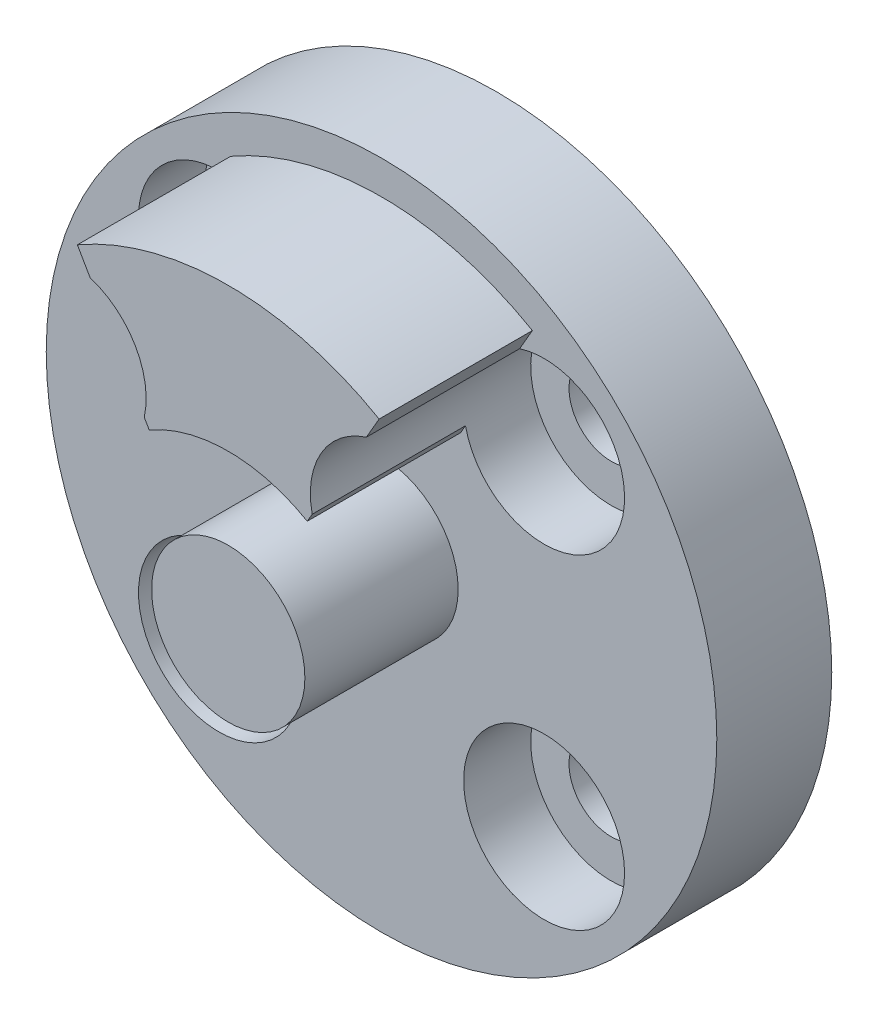
ISO-10303-21;
HEADER;
FILE_DESCRIPTION(('STEP AP214'),'2;1');
FILE_NAME('part.step','',(''),(''),'','','');
FILE_SCHEMA(('AUTOMOTIVE_DESIGN { 1 0 10303 214 1 1 1 1 }'));
ENDSEC;
DATA;
#1=APPLICATION_CONTEXT('core data for automotive mechanical design processes');
#2=APPLICATION_PROTOCOL_DEFINITION('international standard','automotive_design',2000,#1);
#3=PRODUCT_CONTEXT('',#1,'mechanical');
#4=PRODUCT('Part','Part','',(#3));
#5=PRODUCT_RELATED_PRODUCT_CATEGORY('part','',(#4));
#6=PRODUCT_DEFINITION_FORMATION('','',#4);
#7=PRODUCT_DEFINITION_CONTEXT('part definition',#1,'design');
#8=PRODUCT_DEFINITION('design','',#6,#7);
#9=PRODUCT_DEFINITION_SHAPE('','',#8);
#10=(LENGTH_UNIT() NAMED_UNIT(*) SI_UNIT(.MILLI.,.METRE.));
#11=(NAMED_UNIT(*) PLANE_ANGLE_UNIT() SI_UNIT($,.RADIAN.));
#12=(NAMED_UNIT(*) SI_UNIT($,.STERADIAN.) SOLID_ANGLE_UNIT());
#13=UNCERTAINTY_MEASURE_WITH_UNIT(LENGTH_MEASURE(1.E-05),#10,'distance_accuracy_value','');
#14=(GEOMETRIC_REPRESENTATION_CONTEXT(3) GLOBAL_UNCERTAINTY_ASSIGNED_CONTEXT((#13)) GLOBAL_UNIT_ASSIGNED_CONTEXT((#10,
#11,#12)) REPRESENTATION_CONTEXT('',''));
#15=CARTESIAN_POINT('',(0.,0.,0.));
#16=DIRECTION('',(0.,0.,1.));
#17=DIRECTION('',(1.,0.,0.));
#18=AXIS2_PLACEMENT_3D('',#15,#16,#17);
#19=CARTESIAN_POINT('',(-4.12499999999996,7.14470958122165,11.));
#20=DIRECTION('',(0.866025403784441,0.499999999999996,0.));
#21=DIRECTION('',(-0.499999999999996,0.866025403784441,0.));
#22=AXIS2_PLACEMENT_3D('',#19,#20,#21);
#23=PLANE('',#22);
#24=DIRECTION('',(0.,0.,-1.));
#25=VECTOR('',#24,1.);
#26=CARTESIAN_POINT('',(-4.38188693867168,7.58965081080189,22.879393923934));
#27=LINE('',#26,#25);
#28=CARTESIAN_POINT('',(-4.38188693867168,7.58965081080189,3.));
#29=VERTEX_POINT('',#28);
#30=CARTESIAN_POINT('',(-4.38188693867168,7.58965081080189,11.));
#31=VERTEX_POINT('',#30);
#32=EDGE_CURVE('E62',#29,#31,#27,.F.);
#33=ORIENTED_EDGE('',*,*,#32,.F.);
#34=DIRECTION('',(0.499999999999996,-0.866025403784441,0.));
#35=VECTOR('',#34,1.);
#36=CARTESIAN_POINT('',(-4.12499999999996,7.14470958122165,3.));
#37=LINE('',#36,#35);
#38=CARTESIAN_POINT('',(-4.12499999999996,7.14470958122165,3.));
#39=VERTEX_POINT('',#38);
#40=EDGE_CURVE('E141',#29,#39,#37,.T.);
#41=ORIENTED_EDGE('',*,*,#40,.T.);
#42=DIRECTION('',(0.,0.,-1.));
#43=VECTOR('',#42,1.);
#44=CARTESIAN_POINT('',(-4.12499999999996,7.14470958122165,11.));
#45=LINE('',#44,#43);
#46=CARTESIAN_POINT('',(-4.12499999999996,7.14470958122165,11.));
#47=VERTEX_POINT('',#46);
#48=EDGE_CURVE('E155',#47,#39,#45,.T.);
#49=ORIENTED_EDGE('',*,*,#48,.F.);
#50=DIRECTION('',(0.499999999999996,-0.866025403784441,0.));
#51=VECTOR('',#50,1.);
#52=CARTESIAN_POINT('',(-4.12499999999996,7.14470958122165,11.));
#53=LINE('',#52,#51);
#54=EDGE_CURVE('E127',#31,#47,#53,.T.);
#55=ORIENTED_EDGE('',*,*,#54,.F.);
#56=EDGE_LOOP('',(#33,#41,#49,#55));
#57=FACE_BOUND('',#56,.T.);
#58=ADVANCED_FACE('F38',(#57),#23,.F.);
#59=DIRECTION('',(0.,0.,-1.));
#60=VECTOR('',#59,1.);
#61=CARTESIAN_POINT('',(-7.20922297679721,12.4867404789059,22.879393923934));
#62=LINE('',#61,#60);
#63=CARTESIAN_POINT('',(-7.20922297679721,12.4867404789059,11.));
#64=VERTEX_POINT('',#63);
#65=CARTESIAN_POINT('',(-7.20922297679721,12.4867404789059,3.));
#66=VERTEX_POINT('',#65);
#67=EDGE_CURVE('E104',#64,#66,#62,.T.);
#68=ORIENTED_EDGE('',*,*,#67,.F.);
#69=CARTESIAN_POINT('',(-7.87499999999993,13.639900109605,11.));
#70=VERTEX_POINT('',#69);
#71=EDGE_CURVE('E115',#70,#64,#53,.T.);
#72=ORIENTED_EDGE('',*,*,#71,.F.);
#73=DIRECTION('',(0.,0.,-1.));
#74=VECTOR('',#73,1.);
#75=CARTESIAN_POINT('',(-7.87499999999993,13.639900109605,11.));
#76=LINE('',#75,#74);
#77=CARTESIAN_POINT('',(-7.87499999999993,13.639900109605,3.));
#78=VERTEX_POINT('',#77);
#79=EDGE_CURVE('E158',#70,#78,#76,.T.);
#80=ORIENTED_EDGE('',*,*,#79,.T.);
#81=EDGE_CURVE('E118',#78,#66,#37,.T.);
#82=ORIENTED_EDGE('',*,*,#81,.T.);
#83=EDGE_LOOP('',(#68,#72,#80,#82));
#84=FACE_BOUND('',#83,.T.);
#85=ADVANCED_FACE('F114',(#84),#23,.F.);
#86=CARTESIAN_POINT('',(7.87499999999993,13.639900109605,11.));
#87=DIRECTION('',(-0.866025403784441,0.499999999999995,0.));
#88=DIRECTION('',(-0.499999999999995,-0.866025403784441,0.));
#89=AXIS2_PLACEMENT_3D('',#86,#87,#88);
#90=PLANE('',#89);
#91=DIRECTION('',(0.,0.,-1.));
#92=VECTOR('',#91,1.);
#93=CARTESIAN_POINT('',(7.20922297679622,12.4867404789042,22.879393923934));
#94=LINE('',#93,#92);
#95=CARTESIAN_POINT('',(7.20922297679623,12.4867404789042,3.));
#96=VERTEX_POINT('',#95);
#97=CARTESIAN_POINT('',(7.20922297679623,12.4867404789042,11.));
#98=VERTEX_POINT('',#97);
#99=EDGE_CURVE('E54',#96,#98,#94,.F.);
#100=ORIENTED_EDGE('',*,*,#99,.F.);
#101=DIRECTION('',(0.499999999999995,0.866025403784441,0.));
#102=VECTOR('',#101,1.);
#103=CARTESIAN_POINT('',(7.87499999999993,13.639900109605,3.));
#104=LINE('',#103,#102);
#105=CARTESIAN_POINT('',(7.87499999999993,13.639900109605,3.));
#106=VERTEX_POINT('',#105);
#107=EDGE_CURVE('E147',#96,#106,#104,.T.);
#108=ORIENTED_EDGE('',*,*,#107,.T.);
#109=DIRECTION('',(0.,0.,-1.));
#110=VECTOR('',#109,1.);
#111=CARTESIAN_POINT('',(7.87499999999993,13.639900109605,11.));
#112=LINE('',#111,#110);
#113=CARTESIAN_POINT('',(7.87499999999993,13.639900109605,11.));
#114=VERTEX_POINT('',#113);
#115=EDGE_CURVE('E137',#114,#106,#112,.T.);
#116=ORIENTED_EDGE('',*,*,#115,.F.);
#117=DIRECTION('',(0.499999999999995,0.866025403784441,0.));
#118=VECTOR('',#117,1.);
#119=CARTESIAN_POINT('',(7.87499999999993,13.639900109605,11.));
#120=LINE('',#119,#118);
#121=EDGE_CURVE('E129',#98,#114,#120,.T.);
#122=ORIENTED_EDGE('',*,*,#121,.F.);
#123=EDGE_LOOP('',(#100,#108,#116,#122));
#124=FACE_BOUND('',#123,.T.);
#125=ADVANCED_FACE('F219',(#124),#90,.F.);
#126=DIRECTION('',(0.,0.,-1.));
#127=VECTOR('',#126,1.);
#128=CARTESIAN_POINT('',(4.38188693867227,7.58965081080293,22.879393923934));
#129=LINE('',#128,#127);
#130=CARTESIAN_POINT('',(4.38188693867227,7.58965081080293,11.));
#131=VERTEX_POINT('',#130);
#132=CARTESIAN_POINT('',(4.38188693867227,7.58965081080293,3.));
#133=VERTEX_POINT('',#132);
#134=EDGE_CURVE('E184',#131,#133,#129,.T.);
#135=ORIENTED_EDGE('',*,*,#134,.F.);
#136=CARTESIAN_POINT('',(4.12499999999996,7.14470958122164,11.));
#137=VERTEX_POINT('',#136);
#138=EDGE_CURVE('E134',#137,#131,#120,.T.);
#139=ORIENTED_EDGE('',*,*,#138,.F.);
#140=DIRECTION('',(0.,0.,-1.));
#141=VECTOR('',#140,1.);
#142=CARTESIAN_POINT('',(4.12499999999996,7.14470958122164,11.));
#143=LINE('',#142,#141);
#144=CARTESIAN_POINT('',(4.12499999999996,7.14470958122164,3.));
#145=VERTEX_POINT('',#144);
#146=EDGE_CURVE('E153',#137,#145,#143,.T.);
#147=ORIENTED_EDGE('',*,*,#146,.T.);
#148=EDGE_CURVE('E148',#145,#133,#104,.T.);
#149=ORIENTED_EDGE('',*,*,#148,.T.);
#150=EDGE_LOOP('',(#135,#139,#147,#149));
#151=FACE_BOUND('',#150,.T.);
#152=ADVANCED_FACE('F232',(#151),#90,.F.);
#153=CARTESIAN_POINT('',(8.48528137423862,8.48528137423853,9.22253967444338));
#154=DIRECTION('',(0.,0.,-1.));
#155=DIRECTION('',(-1.,0.,0.));
#156=AXIS2_PLACEMENT_3D('',#153,#154,#155);
#157=CYLINDRICAL_SURFACE('',#156,2.2);
#158=CARTESIAN_POINT('',(8.48528137423862,8.48528137423853,-3.));
#159=DIRECTION('',(0.,0.,-1.));
#160=DIRECTION('',(-1.,0.,0.));
#161=AXIS2_PLACEMENT_3D('',#158,#159,#160);
#162=CIRCLE('',#161,2.2);
#163=CARTESIAN_POINT('',(6.28528137423862,8.48528137423853,-3.));
#164=VERTEX_POINT('',#163);
#165=EDGE_CURVE('E191',#164,#164,#162,.T.);
#166=CARTESIAN_POINT('',(8.48528137423862,8.48528137423853,-0.5));
#167=DIRECTION('',(0.,0.,1.));
#168=DIRECTION('',(1.,0.,0.));
#169=AXIS2_PLACEMENT_3D('',#166,#167,#168);
#170=CIRCLE('',#169,2.2);
#171=CARTESIAN_POINT('',(6.28528137423862,8.48528137423853,-0.500000000000002));
#172=VERTEX_POINT('',#171);
#173=EDGE_CURVE('E120',#172,#172,#170,.F.);
#174=CARTESIAN_POINT('',(6.28528137423862,8.48528137423853,-3.));
#175=CARTESIAN_POINT('',(6.28528137423862,8.48528137423853,-2.97395833333333));
#176=CARTESIAN_POINT('',(6.28528137423862,8.48528137423853,-2.94791666666667));
#177=CARTESIAN_POINT('',(6.28528137423862,8.48528137423853,-2.89583333333333));
#178=CARTESIAN_POINT('',(6.28528137423862,8.48528137423853,-2.86979166666667));
#179=CARTESIAN_POINT('',(6.28528137423862,8.48528137423853,-2.81770833333333));
#180=CARTESIAN_POINT('',(6.28528137423862,8.48528137423853,-2.79166666666667));
#181=CARTESIAN_POINT('',(6.28528137423862,8.48528137423853,-2.73958333333333));
#182=CARTESIAN_POINT('',(6.28528137423862,8.48528137423853,-2.71354166666667));
#183=CARTESIAN_POINT('',(6.28528137423862,8.48528137423853,-2.66145833333333));
#184=CARTESIAN_POINT('',(6.28528137423862,8.48528137423853,-2.63541666666667));
#185=CARTESIAN_POINT('',(6.28528137423862,8.48528137423853,-2.58333333333333));
#186=CARTESIAN_POINT('',(6.28528137423862,8.48528137423853,-2.55729166666667));
#187=CARTESIAN_POINT('',(6.28528137423862,8.48528137423853,-2.50520833333333));
#188=CARTESIAN_POINT('',(6.28528137423862,8.48528137423853,-2.47916666666667));
#189=CARTESIAN_POINT('',(6.28528137423862,8.48528137423853,-2.42708333333333));
#190=CARTESIAN_POINT('',(6.28528137423862,8.48528137423853,-2.40104166666667));
#191=CARTESIAN_POINT('',(6.28528137423862,8.48528137423853,-2.34895833333333));
#192=CARTESIAN_POINT('',(6.28528137423862,8.48528137423853,-2.32291666666667));
#193=CARTESIAN_POINT('',(6.28528137423862,8.48528137423853,-2.27083333333334));
#194=CARTESIAN_POINT('',(6.28528137423862,8.48528137423853,-2.24479166666667));
#195=CARTESIAN_POINT('',(6.28528137423862,8.48528137423853,-2.19270833333334));
#196=CARTESIAN_POINT('',(6.28528137423862,8.48528137423853,-2.16666666666667));
#197=CARTESIAN_POINT('',(6.28528137423862,8.48528137423853,-2.11458333333334));
#198=CARTESIAN_POINT('',(6.28528137423862,8.48528137423853,-2.08854166666667));
#199=CARTESIAN_POINT('',(6.28528137423862,8.48528137423853,-2.03645833333333));
#200=CARTESIAN_POINT('',(6.28528137423862,8.48528137423853,-2.01041666666667));
#201=CARTESIAN_POINT('',(6.28528137423862,8.48528137423853,-1.95833333333334));
#202=CARTESIAN_POINT('',(6.28528137423862,8.48528137423853,-1.93229166666667));
#203=CARTESIAN_POINT('',(6.28528137423862,8.48528137423853,-1.88020833333334));
#204=CARTESIAN_POINT('',(6.28528137423862,8.48528137423853,-1.85416666666667));
#205=CARTESIAN_POINT('',(6.28528137423862,8.48528137423853,-1.80208333333334));
#206=CARTESIAN_POINT('',(6.28528137423862,8.48528137423853,-1.77604166666667));
#207=CARTESIAN_POINT('',(6.28528137423862,8.48528137423853,-1.72395833333334));
#208=CARTESIAN_POINT('',(6.28528137423862,8.48528137423853,-1.69791666666667));
#209=CARTESIAN_POINT('',(6.28528137423862,8.48528137423853,-1.64583333333333));
#210=CARTESIAN_POINT('',(6.28528137423862,8.48528137423853,-1.61979166666667));
#211=CARTESIAN_POINT('',(6.28528137423862,8.48528137423853,-1.56770833333333));
#212=CARTESIAN_POINT('',(6.28528137423862,8.48528137423853,-1.54166666666667));
#213=CARTESIAN_POINT('',(6.28528137423862,8.48528137423853,-1.48958333333333));
#214=CARTESIAN_POINT('',(6.28528137423862,8.48528137423853,-1.46354166666667));
#215=CARTESIAN_POINT('',(6.28528137423862,8.48528137423853,-1.41145833333333));
#216=CARTESIAN_POINT('',(6.28528137423862,8.48528137423853,-1.38541666666667));
#217=CARTESIAN_POINT('',(6.28528137423862,8.48528137423853,-1.33333333333333));
#218=CARTESIAN_POINT('',(6.28528137423862,8.48528137423853,-1.30729166666667));
#219=CARTESIAN_POINT('',(6.28528137423862,8.48528137423853,-1.25520833333333));
#220=CARTESIAN_POINT('',(6.28528137423862,8.48528137423853,-1.22916666666667));
#221=CARTESIAN_POINT('',(6.28528137423862,8.48528137423853,-1.17708333333333));
#222=CARTESIAN_POINT('',(6.28528137423862,8.48528137423853,-1.15104166666667));
#223=CARTESIAN_POINT('',(6.28528137423862,8.48528137423853,-1.09895833333334));
#224=CARTESIAN_POINT('',(6.28528137423862,8.48528137423853,-1.07291666666667));
#225=CARTESIAN_POINT('',(6.28528137423862,8.48528137423853,-1.02083333333333));
#226=CARTESIAN_POINT('',(6.28528137423862,8.48528137423853,-0.994791666666669));
#227=CARTESIAN_POINT('',(6.28528137423862,8.48528137423853,-0.942708333333336));
#228=CARTESIAN_POINT('',(6.28528137423862,8.48528137423853,-0.916666666666669));
#229=CARTESIAN_POINT('',(6.28528137423862,8.48528137423853,-0.864583333333336));
#230=CARTESIAN_POINT('',(6.28528137423862,8.48528137423853,-0.838541666666669));
#231=CARTESIAN_POINT('',(6.28528137423862,8.48528137423853,-0.786458333333336));
#232=CARTESIAN_POINT('',(6.28528137423862,8.48528137423853,-0.760416666666669));
#233=CARTESIAN_POINT('',(6.28528137423862,8.48528137423853,-0.708333333333336));
#234=CARTESIAN_POINT('',(6.28528137423862,8.48528137423853,-0.682291666666669));
#235=CARTESIAN_POINT('',(6.28528137423862,8.48528137423853,-0.630208333333336));
#236=CARTESIAN_POINT('',(6.28528137423862,8.48528137423853,-0.604166666666669));
#237=CARTESIAN_POINT('',(6.28528137423862,8.48528137423853,-0.552083333333335));
#238=CARTESIAN_POINT('',(6.28528137423862,8.48528137423853,-0.526041666666669));
#239=CARTESIAN_POINT('',(6.28528137423862,8.48528137423853,-0.500000000000002));
#240=B_SPLINE_CURVE_WITH_KNOTS('',3,(#174,#175,#176,#177,#178,#179,#180,#181,#182,#183,#184,
#185,#186,#187,#188,#189,#190,#191,#192,#193,#194,#195,#196,#197,#198,#199,#200,#201,#202,#203,
#204,#205,#206,#207,#208,#209,#210,#211,#212,#213,#214,#215,#216,#217,#218,#219,#220,#221,#222,
#223,#224,#225,#226,#227,#228,#229,#230,#231,#232,#233,#234,#235,#236,#237,#238,#239),
.UNSPECIFIED.,.F.,.F.,(4,2,2,2,2,2,2,2,2,2,2,2,2,2,2,2,2,2,2,2,2,2,2,2,2,2,2,2,2,2,2,2,4),(0.,
0.0781250000000001,0.15625,0.234375,0.3125,0.390625,0.46875,0.546875,0.625000000000001,
0.703124999999999,0.781249999999999,0.859374999999999,0.937499999999999,1.015625,1.09375,
1.171875,1.25,1.328125,1.40625,1.484375,1.5625,1.640625,1.71875,1.796875,1.875,1.953125,2.03125,
2.109375,2.1875,2.265625,2.34375,2.421875,2.5),.UNSPECIFIED.);
#241=EDGE_CURVE('BSEAM266',#164,#172,#240,.T.);
#242=ORIENTED_EDGE('',*,*,#165,.T.);
#243=ORIENTED_EDGE('',*,*,#173,.F.);
#244=ORIENTED_EDGE('',*,*,#241,.T.);
#245=ORIENTED_EDGE('',*,*,#241,.F.);
#246=EDGE_LOOP('',(#242,#244,#243,#245));
#247=FACE_BOUND('',#246,.T.);
#248=ADVANCED_FACE('F266',(#247),#157,.F.);
#249=CARTESIAN_POINT('',(-8.48528137423857,8.48528137423905,9.22253967444338));
#250=DIRECTION('',(0.,0.,-1.));
#251=DIRECTION('',(-1.,0.,0.));
#252=AXIS2_PLACEMENT_3D('',#249,#250,#251);
#253=CYLINDRICAL_SURFACE('',#252,2.20000000000044);
#254=CARTESIAN_POINT('',(-8.48528137423857,8.48528137423905,-3.));
#255=DIRECTION('',(0.,0.,-1.));
#256=DIRECTION('',(-1.,0.,0.));
#257=AXIS2_PLACEMENT_3D('',#254,#255,#256);
#258=CIRCLE('',#257,2.20000000000044);
#259=CARTESIAN_POINT('',(-10.685281374239,8.48528137423905,-3.));
#260=VERTEX_POINT('',#259);
#261=EDGE_CURVE('E188',#260,#260,#258,.T.);
#262=CARTESIAN_POINT('',(-8.48528137423857,8.48528137423905,-0.5));
#263=DIRECTION('',(0.,0.,1.));
#264=DIRECTION('',(1.,0.,0.));
#265=AXIS2_PLACEMENT_3D('',#262,#263,#264);
#266=CIRCLE('',#265,2.20000000000044);
#267=CARTESIAN_POINT('',(-10.685281374239,8.48528137423905,-0.500000000000002));
#268=VERTEX_POINT('',#267);
#269=EDGE_CURVE('E171',#268,#268,#266,.F.);
#270=CARTESIAN_POINT('',(-10.685281374239,8.48528137423905,-3.));
#271=CARTESIAN_POINT('',(-10.685281374239,8.48528137423905,-2.97395833333333));
#272=CARTESIAN_POINT('',(-10.685281374239,8.48528137423905,-2.94791666666667));
#273=CARTESIAN_POINT('',(-10.685281374239,8.48528137423905,-2.89583333333333));
#274=CARTESIAN_POINT('',(-10.685281374239,8.48528137423905,-2.86979166666667));
#275=CARTESIAN_POINT('',(-10.685281374239,8.48528137423905,-2.81770833333333));
#276=CARTESIAN_POINT('',(-10.685281374239,8.48528137423905,-2.79166666666667));
#277=CARTESIAN_POINT('',(-10.685281374239,8.48528137423905,-2.73958333333333));
#278=CARTESIAN_POINT('',(-10.685281374239,8.48528137423905,-2.71354166666667));
#279=CARTESIAN_POINT('',(-10.685281374239,8.48528137423905,-2.66145833333333));
#280=CARTESIAN_POINT('',(-10.685281374239,8.48528137423905,-2.63541666666667));
#281=CARTESIAN_POINT('',(-10.685281374239,8.48528137423905,-2.58333333333333));
#282=CARTESIAN_POINT('',(-10.685281374239,8.48528137423905,-2.55729166666667));
#283=CARTESIAN_POINT('',(-10.685281374239,8.48528137423905,-2.50520833333333));
#284=CARTESIAN_POINT('',(-10.685281374239,8.48528137423905,-2.47916666666667));
#285=CARTESIAN_POINT('',(-10.685281374239,8.48528137423905,-2.42708333333333));
#286=CARTESIAN_POINT('',(-10.685281374239,8.48528137423905,-2.40104166666667));
#287=CARTESIAN_POINT('',(-10.685281374239,8.48528137423905,-2.34895833333333));
#288=CARTESIAN_POINT('',(-10.685281374239,8.48528137423905,-2.32291666666667));
#289=CARTESIAN_POINT('',(-10.685281374239,8.48528137423905,-2.27083333333334));
#290=CARTESIAN_POINT('',(-10.685281374239,8.48528137423905,-2.24479166666667));
#291=CARTESIAN_POINT('',(-10.685281374239,8.48528137423905,-2.19270833333334));
#292=CARTESIAN_POINT('',(-10.685281374239,8.48528137423905,-2.16666666666667));
#293=CARTESIAN_POINT('',(-10.685281374239,8.48528137423905,-2.11458333333334));
#294=CARTESIAN_POINT('',(-10.685281374239,8.48528137423905,-2.08854166666667));
#295=CARTESIAN_POINT('',(-10.685281374239,8.48528137423905,-2.03645833333333));
#296=CARTESIAN_POINT('',(-10.685281374239,8.48528137423905,-2.01041666666667));
#297=CARTESIAN_POINT('',(-10.685281374239,8.48528137423905,-1.95833333333334));
#298=CARTESIAN_POINT('',(-10.685281374239,8.48528137423905,-1.93229166666667));
#299=CARTESIAN_POINT('',(-10.685281374239,8.48528137423905,-1.88020833333334));
#300=CARTESIAN_POINT('',(-10.685281374239,8.48528137423905,-1.85416666666667));
#301=CARTESIAN_POINT('',(-10.685281374239,8.48528137423905,-1.80208333333334));
#302=CARTESIAN_POINT('',(-10.685281374239,8.48528137423905,-1.77604166666667));
#303=CARTESIAN_POINT('',(-10.685281374239,8.48528137423905,-1.72395833333334));
#304=CARTESIAN_POINT('',(-10.685281374239,8.48528137423905,-1.69791666666667));
#305=CARTESIAN_POINT('',(-10.685281374239,8.48528137423905,-1.64583333333333));
#306=CARTESIAN_POINT('',(-10.685281374239,8.48528137423905,-1.61979166666667));
#307=CARTESIAN_POINT('',(-10.685281374239,8.48528137423905,-1.56770833333333));
#308=CARTESIAN_POINT('',(-10.685281374239,8.48528137423905,-1.54166666666667));
#309=CARTESIAN_POINT('',(-10.685281374239,8.48528137423905,-1.48958333333333));
#310=CARTESIAN_POINT('',(-10.685281374239,8.48528137423905,-1.46354166666667));
#311=CARTESIAN_POINT('',(-10.685281374239,8.48528137423905,-1.41145833333333));
#312=CARTESIAN_POINT('',(-10.685281374239,8.48528137423905,-1.38541666666667));
#313=CARTESIAN_POINT('',(-10.685281374239,8.48528137423905,-1.33333333333333));
#314=CARTESIAN_POINT('',(-10.685281374239,8.48528137423905,-1.30729166666667));
#315=CARTESIAN_POINT('',(-10.685281374239,8.48528137423905,-1.25520833333333));
#316=CARTESIAN_POINT('',(-10.685281374239,8.48528137423905,-1.22916666666667));
#317=CARTESIAN_POINT('',(-10.685281374239,8.48528137423905,-1.17708333333333));
#318=CARTESIAN_POINT('',(-10.685281374239,8.48528137423905,-1.15104166666667));
#319=CARTESIAN_POINT('',(-10.685281374239,8.48528137423905,-1.09895833333334));
#320=CARTESIAN_POINT('',(-10.685281374239,8.48528137423905,-1.07291666666667));
#321=CARTESIAN_POINT('',(-10.685281374239,8.48528137423905,-1.02083333333333));
#322=CARTESIAN_POINT('',(-10.685281374239,8.48528137423905,-0.994791666666669));
#323=CARTESIAN_POINT('',(-10.685281374239,8.48528137423905,-0.942708333333336));
#324=CARTESIAN_POINT('',(-10.685281374239,8.48528137423905,-0.916666666666669));
#325=CARTESIAN_POINT('',(-10.685281374239,8.48528137423905,-0.864583333333336));
#326=CARTESIAN_POINT('',(-10.685281374239,8.48528137423905,-0.838541666666669));
#327=CARTESIAN_POINT('',(-10.685281374239,8.48528137423905,-0.786458333333336));
#328=CARTESIAN_POINT('',(-10.685281374239,8.48528137423905,-0.760416666666669));
#329=CARTESIAN_POINT('',(-10.685281374239,8.48528137423905,-0.708333333333336));
#330=CARTESIAN_POINT('',(-10.685281374239,8.48528137423905,-0.682291666666669));
#331=CARTESIAN_POINT('',(-10.685281374239,8.48528137423905,-0.630208333333336));
#332=CARTESIAN_POINT('',(-10.685281374239,8.48528137423905,-0.604166666666669));
#333=CARTESIAN_POINT('',(-10.685281374239,8.48528137423905,-0.552083333333335));
#334=CARTESIAN_POINT('',(-10.685281374239,8.48528137423905,-0.526041666666669));
#335=CARTESIAN_POINT('',(-10.685281374239,8.48528137423905,-0.500000000000002));
#336=B_SPLINE_CURVE_WITH_KNOTS('',3,(#270,#271,#272,#273,#274,#275,#276,#277,#278,#279,#280,
#281,#282,#283,#284,#285,#286,#287,#288,#289,#290,#291,#292,#293,#294,#295,#296,#297,#298,#299,
#300,#301,#302,#303,#304,#305,#306,#307,#308,#309,#310,#311,#312,#313,#314,#315,#316,#317,#318,
#319,#320,#321,#322,#323,#324,#325,#326,#327,#328,#329,#330,#331,#332,#333,#334,#335),
.UNSPECIFIED.,.F.,.F.,(4,2,2,2,2,2,2,2,2,2,2,2,2,2,2,2,2,2,2,2,2,2,2,2,2,2,2,2,2,2,2,2,4),(0.,
0.0781250000000001,0.15625,0.234375,0.3125,0.390625,0.46875,0.546875,0.625000000000001,
0.703124999999999,0.781249999999999,0.859374999999999,0.937499999999999,1.015625,1.09375,
1.171875,1.25,1.328125,1.40625,1.484375,1.5625,1.640625,1.71875,1.796875,1.875,1.953125,2.03125,
2.109375,2.1875,2.265625,2.34375,2.421875,2.5),.UNSPECIFIED.);
#337=EDGE_CURVE('BSEAM269',#260,#268,#336,.T.);
#338=ORIENTED_EDGE('',*,*,#261,.T.);
#339=ORIENTED_EDGE('',*,*,#269,.F.);
#340=ORIENTED_EDGE('',*,*,#337,.T.);
#341=ORIENTED_EDGE('',*,*,#337,.F.);
#342=EDGE_LOOP('',(#338,#340,#339,#341));
#343=FACE_BOUND('',#342,.T.);
#344=ADVANCED_FACE('F269',(#343),#253,.F.);
#345=CARTESIAN_POINT('',(-8.48528137423906,-8.48528137423809,9.22253967444338));
#346=DIRECTION('',(0.,0.,-1.));
#347=DIRECTION('',(-1.,0.,0.));
#348=AXIS2_PLACEMENT_3D('',#345,#346,#347);
#349=CYLINDRICAL_SURFACE('',#348,2.20000000000062);
#350=CARTESIAN_POINT('',(-8.48528137423906,-8.48528137423809,-3.));
#351=DIRECTION('',(0.,0.,-1.));
#352=DIRECTION('',(-1.,0.,0.));
#353=AXIS2_PLACEMENT_3D('',#350,#351,#352);
#354=CIRCLE('',#353,2.20000000000062);
#355=CARTESIAN_POINT('',(-10.6852813742397,-8.48528137423809,-3.));
#356=VERTEX_POINT('',#355);
#357=EDGE_CURVE('E192',#356,#356,#354,.T.);
#358=CARTESIAN_POINT('',(-8.48528137423906,-8.48528137423809,-0.5));
#359=DIRECTION('',(0.,0.,1.));
#360=DIRECTION('',(1.,0.,0.));
#361=AXIS2_PLACEMENT_3D('',#358,#359,#360);
#362=CIRCLE('',#361,2.20000000000062);
#363=CARTESIAN_POINT('',(-10.6852813742397,-8.48528137423809,-0.500000000000002));
#364=VERTEX_POINT('',#363);
#365=EDGE_CURVE('E168',#364,#364,#362,.F.);
#366=CARTESIAN_POINT('',(-10.6852813742397,-8.48528137423809,-3.));
#367=CARTESIAN_POINT('',(-10.6852813742397,-8.48528137423809,-2.97395833333333));
#368=CARTESIAN_POINT('',(-10.6852813742397,-8.48528137423809,-2.94791666666667));
#369=CARTESIAN_POINT('',(-10.6852813742397,-8.48528137423809,-2.89583333333333));
#370=CARTESIAN_POINT('',(-10.6852813742397,-8.48528137423809,-2.86979166666667));
#371=CARTESIAN_POINT('',(-10.6852813742397,-8.48528137423809,-2.81770833333333));
#372=CARTESIAN_POINT('',(-10.6852813742397,-8.48528137423809,-2.79166666666667));
#373=CARTESIAN_POINT('',(-10.6852813742397,-8.48528137423809,-2.73958333333333));
#374=CARTESIAN_POINT('',(-10.6852813742397,-8.48528137423809,-2.71354166666667));
#375=CARTESIAN_POINT('',(-10.6852813742397,-8.48528137423809,-2.66145833333333));
#376=CARTESIAN_POINT('',(-10.6852813742397,-8.48528137423809,-2.63541666666667));
#377=CARTESIAN_POINT('',(-10.6852813742397,-8.48528137423809,-2.58333333333333));
#378=CARTESIAN_POINT('',(-10.6852813742397,-8.48528137423809,-2.55729166666667));
#379=CARTESIAN_POINT('',(-10.6852813742397,-8.48528137423809,-2.50520833333333));
#380=CARTESIAN_POINT('',(-10.6852813742397,-8.48528137423809,-2.47916666666667));
#381=CARTESIAN_POINT('',(-10.6852813742397,-8.48528137423809,-2.42708333333333));
#382=CARTESIAN_POINT('',(-10.6852813742397,-8.48528137423809,-2.40104166666667));
#383=CARTESIAN_POINT('',(-10.6852813742397,-8.48528137423809,-2.34895833333333));
#384=CARTESIAN_POINT('',(-10.6852813742397,-8.48528137423809,-2.32291666666667));
#385=CARTESIAN_POINT('',(-10.6852813742397,-8.48528137423809,-2.27083333333334));
#386=CARTESIAN_POINT('',(-10.6852813742397,-8.48528137423809,-2.24479166666667));
#387=CARTESIAN_POINT('',(-10.6852813742397,-8.48528137423809,-2.19270833333334));
#388=CARTESIAN_POINT('',(-10.6852813742397,-8.48528137423809,-2.16666666666667));
#389=CARTESIAN_POINT('',(-10.6852813742397,-8.48528137423809,-2.11458333333334));
#390=CARTESIAN_POINT('',(-10.6852813742397,-8.48528137423809,-2.08854166666667));
#391=CARTESIAN_POINT('',(-10.6852813742397,-8.48528137423809,-2.03645833333333));
#392=CARTESIAN_POINT('',(-10.6852813742397,-8.48528137423809,-2.01041666666667));
#393=CARTESIAN_POINT('',(-10.6852813742397,-8.48528137423809,-1.95833333333334));
#394=CARTESIAN_POINT('',(-10.6852813742397,-8.48528137423809,-1.93229166666667));
#395=CARTESIAN_POINT('',(-10.6852813742397,-8.48528137423809,-1.88020833333334));
#396=CARTESIAN_POINT('',(-10.6852813742397,-8.48528137423809,-1.85416666666667));
#397=CARTESIAN_POINT('',(-10.6852813742397,-8.48528137423809,-1.80208333333334));
#398=CARTESIAN_POINT('',(-10.6852813742397,-8.48528137423809,-1.77604166666667));
#399=CARTESIAN_POINT('',(-10.6852813742397,-8.48528137423809,-1.72395833333334));
#400=CARTESIAN_POINT('',(-10.6852813742397,-8.48528137423809,-1.69791666666667));
#401=CARTESIAN_POINT('',(-10.6852813742397,-8.48528137423809,-1.64583333333333));
#402=CARTESIAN_POINT('',(-10.6852813742397,-8.48528137423809,-1.61979166666667));
#403=CARTESIAN_POINT('',(-10.6852813742397,-8.48528137423809,-1.56770833333333));
#404=CARTESIAN_POINT('',(-10.6852813742397,-8.48528137423809,-1.54166666666667));
#405=CARTESIAN_POINT('',(-10.6852813742397,-8.48528137423809,-1.48958333333333));
#406=CARTESIAN_POINT('',(-10.6852813742397,-8.48528137423809,-1.46354166666667));
#407=CARTESIAN_POINT('',(-10.6852813742397,-8.48528137423809,-1.41145833333333));
#408=CARTESIAN_POINT('',(-10.6852813742397,-8.48528137423809,-1.38541666666667));
#409=CARTESIAN_POINT('',(-10.6852813742397,-8.48528137423809,-1.33333333333333));
#410=CARTESIAN_POINT('',(-10.6852813742397,-8.48528137423809,-1.30729166666667));
#411=CARTESIAN_POINT('',(-10.6852813742397,-8.48528137423809,-1.25520833333333));
#412=CARTESIAN_POINT('',(-10.6852813742397,-8.48528137423809,-1.22916666666667));
#413=CARTESIAN_POINT('',(-10.6852813742397,-8.48528137423809,-1.17708333333333));
#414=CARTESIAN_POINT('',(-10.6852813742397,-8.48528137423809,-1.15104166666667));
#415=CARTESIAN_POINT('',(-10.6852813742397,-8.48528137423809,-1.09895833333334));
#416=CARTESIAN_POINT('',(-10.6852813742397,-8.48528137423809,-1.07291666666667));
#417=CARTESIAN_POINT('',(-10.6852813742397,-8.48528137423809,-1.02083333333333));
#418=CARTESIAN_POINT('',(-10.6852813742397,-8.48528137423809,-0.994791666666669));
#419=CARTESIAN_POINT('',(-10.6852813742397,-8.48528137423809,-0.942708333333336));
#420=CARTESIAN_POINT('',(-10.6852813742397,-8.48528137423809,-0.916666666666669));
#421=CARTESIAN_POINT('',(-10.6852813742397,-8.48528137423809,-0.864583333333336));
#422=CARTESIAN_POINT('',(-10.6852813742397,-8.48528137423809,-0.838541666666669));
#423=CARTESIAN_POINT('',(-10.6852813742397,-8.48528137423809,-0.786458333333336));
#424=CARTESIAN_POINT('',(-10.6852813742397,-8.48528137423809,-0.760416666666669));
#425=CARTESIAN_POINT('',(-10.6852813742397,-8.48528137423809,-0.708333333333336));
#426=CARTESIAN_POINT('',(-10.6852813742397,-8.48528137423809,-0.682291666666669));
#427=CARTESIAN_POINT('',(-10.6852813742397,-8.48528137423809,-0.630208333333336));
#428=CARTESIAN_POINT('',(-10.6852813742397,-8.48528137423809,-0.604166666666669));
#429=CARTESIAN_POINT('',(-10.6852813742397,-8.48528137423809,-0.552083333333335));
#430=CARTESIAN_POINT('',(-10.6852813742397,-8.48528137423809,-0.526041666666669));
#431=CARTESIAN_POINT('',(-10.6852813742397,-8.48528137423809,-0.500000000000002));
#432=B_SPLINE_CURVE_WITH_KNOTS('',3,(#366,#367,#368,#369,#370,#371,#372,#373,#374,#375,#376,
#377,#378,#379,#380,#381,#382,#383,#384,#385,#386,#387,#388,#389,#390,#391,#392,#393,#394,#395,
#396,#397,#398,#399,#400,#401,#402,#403,#404,#405,#406,#407,#408,#409,#410,#411,#412,#413,#414,
#415,#416,#417,#418,#419,#420,#421,#422,#423,#424,#425,#426,#427,#428,#429,#430,#431),
.UNSPECIFIED.,.F.,.F.,(4,2,2,2,2,2,2,2,2,2,2,2,2,2,2,2,2,2,2,2,2,2,2,2,2,2,2,2,2,2,2,2,4),(0.,
0.0781250000000001,0.15625,0.234375,0.3125,0.390625,0.46875,0.546875,0.625000000000001,
0.703124999999999,0.781249999999999,0.859374999999999,0.937499999999999,1.015625,1.09375,
1.171875,1.25,1.328125,1.40625,1.484375,1.5625,1.640625,1.71875,1.796875,1.875,1.953125,2.03125,
2.109375,2.1875,2.265625,2.34375,2.421875,2.5),.UNSPECIFIED.);
#433=EDGE_CURVE('BSEAM306',#356,#364,#432,.T.);
#434=ORIENTED_EDGE('',*,*,#357,.T.);
#435=ORIENTED_EDGE('',*,*,#365,.F.);
#436=ORIENTED_EDGE('',*,*,#433,.T.);
#437=ORIENTED_EDGE('',*,*,#433,.F.);
#438=EDGE_LOOP('',(#434,#436,#435,#437));
#439=FACE_BOUND('',#438,.T.);
#440=ADVANCED_FACE('F306',(#439),#349,.F.);
#441=CARTESIAN_POINT('',(8.48528137423809,-8.48528137423858,9.22253967444338));
#442=DIRECTION('',(0.,0.,-1.));
#443=DIRECTION('',(-1.,0.,0.));
#444=AXIS2_PLACEMENT_3D('',#441,#442,#443);
#445=CYLINDRICAL_SURFACE('',#444,2.2000000000002);
#446=CARTESIAN_POINT('',(8.48528137423809,-8.48528137423858,-3.));
#447=DIRECTION('',(0.,0.,-1.));
#448=DIRECTION('',(-1.,0.,0.));
#449=AXIS2_PLACEMENT_3D('',#446,#447,#448);
#450=CIRCLE('',#449,2.2000000000002);
#451=CARTESIAN_POINT('',(6.28528137423789,-8.48528137423858,-3.));
#452=VERTEX_POINT('',#451);
#453=EDGE_CURVE('E180',#452,#452,#450,.T.);
#454=CARTESIAN_POINT('',(8.48528137423809,-8.48528137423858,-0.5));
#455=DIRECTION('',(0.,0.,1.));
#456=DIRECTION('',(1.,0.,0.));
#457=AXIS2_PLACEMENT_3D('',#454,#455,#456);
#458=CIRCLE('',#457,2.2000000000002);
#459=CARTESIAN_POINT('',(6.28528137423789,-8.48528137423858,-0.500000000000002));
#460=VERTEX_POINT('',#459);
#461=EDGE_CURVE('E165',#460,#460,#458,.F.);
#462=CARTESIAN_POINT('',(6.28528137423789,-8.48528137423858,-3.));
#463=CARTESIAN_POINT('',(6.28528137423789,-8.48528137423858,-2.97395833333333));
#464=CARTESIAN_POINT('',(6.28528137423789,-8.48528137423858,-2.94791666666667));
#465=CARTESIAN_POINT('',(6.28528137423789,-8.48528137423858,-2.89583333333333));
#466=CARTESIAN_POINT('',(6.28528137423789,-8.48528137423858,-2.86979166666667));
#467=CARTESIAN_POINT('',(6.28528137423789,-8.48528137423858,-2.81770833333333));
#468=CARTESIAN_POINT('',(6.28528137423789,-8.48528137423858,-2.79166666666667));
#469=CARTESIAN_POINT('',(6.28528137423789,-8.48528137423858,-2.73958333333333));
#470=CARTESIAN_POINT('',(6.28528137423789,-8.48528137423858,-2.71354166666667));
#471=CARTESIAN_POINT('',(6.28528137423789,-8.48528137423858,-2.66145833333333));
#472=CARTESIAN_POINT('',(6.28528137423789,-8.48528137423858,-2.63541666666667));
#473=CARTESIAN_POINT('',(6.28528137423789,-8.48528137423858,-2.58333333333333));
#474=CARTESIAN_POINT('',(6.28528137423789,-8.48528137423858,-2.55729166666667));
#475=CARTESIAN_POINT('',(6.28528137423789,-8.48528137423858,-2.50520833333333));
#476=CARTESIAN_POINT('',(6.28528137423789,-8.48528137423858,-2.47916666666667));
#477=CARTESIAN_POINT('',(6.28528137423789,-8.48528137423858,-2.42708333333333));
#478=CARTESIAN_POINT('',(6.28528137423789,-8.48528137423858,-2.40104166666667));
#479=CARTESIAN_POINT('',(6.28528137423789,-8.48528137423858,-2.34895833333333));
#480=CARTESIAN_POINT('',(6.28528137423789,-8.48528137423858,-2.32291666666667));
#481=CARTESIAN_POINT('',(6.28528137423789,-8.48528137423858,-2.27083333333334));
#482=CARTESIAN_POINT('',(6.28528137423789,-8.48528137423858,-2.24479166666667));
#483=CARTESIAN_POINT('',(6.28528137423789,-8.48528137423858,-2.19270833333334));
#484=CARTESIAN_POINT('',(6.28528137423789,-8.48528137423858,-2.16666666666667));
#485=CARTESIAN_POINT('',(6.28528137423789,-8.48528137423858,-2.11458333333334));
#486=CARTESIAN_POINT('',(6.28528137423789,-8.48528137423858,-2.08854166666667));
#487=CARTESIAN_POINT('',(6.28528137423789,-8.48528137423858,-2.03645833333333));
#488=CARTESIAN_POINT('',(6.28528137423789,-8.48528137423858,-2.01041666666667));
#489=CARTESIAN_POINT('',(6.28528137423789,-8.48528137423858,-1.95833333333334));
#490=CARTESIAN_POINT('',(6.28528137423789,-8.48528137423858,-1.93229166666667));
#491=CARTESIAN_POINT('',(6.28528137423789,-8.48528137423858,-1.88020833333334));
#492=CARTESIAN_POINT('',(6.28528137423789,-8.48528137423858,-1.85416666666667));
#493=CARTESIAN_POINT('',(6.28528137423789,-8.48528137423858,-1.80208333333334));
#494=CARTESIAN_POINT('',(6.28528137423789,-8.48528137423858,-1.77604166666667));
#495=CARTESIAN_POINT('',(6.28528137423789,-8.48528137423858,-1.72395833333334));
#496=CARTESIAN_POINT('',(6.28528137423789,-8.48528137423858,-1.69791666666667));
#497=CARTESIAN_POINT('',(6.28528137423789,-8.48528137423858,-1.64583333333333));
#498=CARTESIAN_POINT('',(6.28528137423789,-8.48528137423858,-1.61979166666667));
#499=CARTESIAN_POINT('',(6.28528137423789,-8.48528137423858,-1.56770833333333));
#500=CARTESIAN_POINT('',(6.28528137423789,-8.48528137423858,-1.54166666666667));
#501=CARTESIAN_POINT('',(6.28528137423789,-8.48528137423858,-1.48958333333333));
#502=CARTESIAN_POINT('',(6.28528137423789,-8.48528137423858,-1.46354166666667));
#503=CARTESIAN_POINT('',(6.28528137423789,-8.48528137423858,-1.41145833333333));
#504=CARTESIAN_POINT('',(6.28528137423789,-8.48528137423858,-1.38541666666667));
#505=CARTESIAN_POINT('',(6.28528137423789,-8.48528137423858,-1.33333333333333));
#506=CARTESIAN_POINT('',(6.28528137423789,-8.48528137423858,-1.30729166666667));
#507=CARTESIAN_POINT('',(6.28528137423789,-8.48528137423858,-1.25520833333333));
#508=CARTESIAN_POINT('',(6.28528137423789,-8.48528137423858,-1.22916666666667));
#509=CARTESIAN_POINT('',(6.28528137423789,-8.48528137423858,-1.17708333333333));
#510=CARTESIAN_POINT('',(6.28528137423789,-8.48528137423858,-1.15104166666667));
#511=CARTESIAN_POINT('',(6.28528137423789,-8.48528137423858,-1.09895833333334));
#512=CARTESIAN_POINT('',(6.28528137423789,-8.48528137423858,-1.07291666666667));
#513=CARTESIAN_POINT('',(6.28528137423789,-8.48528137423858,-1.02083333333333));
#514=CARTESIAN_POINT('',(6.28528137423789,-8.48528137423858,-0.994791666666669));
#515=CARTESIAN_POINT('',(6.28528137423789,-8.48528137423858,-0.942708333333336));
#516=CARTESIAN_POINT('',(6.28528137423789,-8.48528137423858,-0.916666666666669));
#517=CARTESIAN_POINT('',(6.28528137423789,-8.48528137423858,-0.864583333333336));
#518=CARTESIAN_POINT('',(6.28528137423789,-8.48528137423858,-0.838541666666669));
#519=CARTESIAN_POINT('',(6.28528137423789,-8.48528137423858,-0.786458333333336));
#520=CARTESIAN_POINT('',(6.28528137423789,-8.48528137423858,-0.760416666666669));
#521=CARTESIAN_POINT('',(6.28528137423789,-8.48528137423858,-0.708333333333336));
#522=CARTESIAN_POINT('',(6.28528137423789,-8.48528137423858,-0.682291666666669));
#523=CARTESIAN_POINT('',(6.28528137423789,-8.48528137423858,-0.630208333333336));
#524=CARTESIAN_POINT('',(6.28528137423789,-8.48528137423858,-0.604166666666669));
#525=CARTESIAN_POINT('',(6.28528137423789,-8.48528137423858,-0.552083333333335));
#526=CARTESIAN_POINT('',(6.28528137423789,-8.48528137423858,-0.526041666666669));
#527=CARTESIAN_POINT('',(6.28528137423789,-8.48528137423858,-0.500000000000002));
#528=B_SPLINE_CURVE_WITH_KNOTS('',3,(#462,#463,#464,#465,#466,#467,#468,#469,#470,#471,#472,
#473,#474,#475,#476,#477,#478,#479,#480,#481,#482,#483,#484,#485,#486,#487,#488,#489,#490,#491,
#492,#493,#494,#495,#496,#497,#498,#499,#500,#501,#502,#503,#504,#505,#506,#507,#508,#509,#510,
#511,#512,#513,#514,#515,#516,#517,#518,#519,#520,#521,#522,#523,#524,#525,#526,#527),
.UNSPECIFIED.,.F.,.F.,(4,2,2,2,2,2,2,2,2,2,2,2,2,2,2,2,2,2,2,2,2,2,2,2,2,2,2,2,2,2,2,2,4),(0.,
0.0781250000000001,0.15625,0.234375,0.3125,0.390625,0.46875,0.546875,0.625000000000001,
0.703124999999999,0.781249999999999,0.859374999999999,0.937499999999999,1.015625,1.09375,
1.171875,1.25,1.328125,1.40625,1.484375,1.5625,1.640625,1.71875,1.796875,1.875,1.953125,2.03125,
2.109375,2.1875,2.265625,2.34375,2.421875,2.5),.UNSPECIFIED.);
#529=EDGE_CURVE('BSEAM209',#452,#460,#528,.T.);
#530=ORIENTED_EDGE('',*,*,#453,.T.);
#531=ORIENTED_EDGE('',*,*,#461,.F.);
#532=ORIENTED_EDGE('',*,*,#529,.T.);
#533=ORIENTED_EDGE('',*,*,#529,.F.);
#534=EDGE_LOOP('',(#530,#532,#531,#533));
#535=FACE_BOUND('',#534,.T.);
#536=ADVANCED_FACE('F209',(#535),#445,.F.);
#537=CARTESIAN_POINT('',(0.,0.,3.));
#538=DIRECTION('',(0.,0.,1.));
#539=DIRECTION('',(1.,0.,0.));
#540=AXIS2_PLACEMENT_3D('',#537,#538,#539);
#541=PLANE('',#540);
#542=CARTESIAN_POINT('',(8.485281374238,-8.48528137423915,3.));
#543=DIRECTION('',(0.,0.,1.));
#544=DIRECTION('',(1.,0.,0.));
#545=AXIS2_PLACEMENT_3D('',#542,#543,#544);
#546=CIRCLE('',#545,4.2);
#547=CARTESIAN_POINT('',(12.685281374238,-8.48528137423915,3.));
#548=VERTEX_POINT('',#547);
#549=EDGE_CURVE('E42',#548,#548,#546,.F.);
#550=ORIENTED_EDGE('',*,*,#549,.T.);
#551=EDGE_LOOP('',(#550));
#552=FACE_BOUND('',#551,.T.);
#553=CARTESIAN_POINT('',(-8.48528137423906,-8.48528137423809,3.));
#554=DIRECTION('',(0.,0.,1.));
#555=DIRECTION('',(1.,0.,0.));
#556=AXIS2_PLACEMENT_3D('',#553,#554,#555);
#557=CIRCLE('',#556,4.2);
#558=CARTESIAN_POINT('',(-4.28528137423906,-8.48528137423809,3.));
#559=VERTEX_POINT('',#558);
#560=EDGE_CURVE('E175',#559,#559,#557,.F.);
#561=ORIENTED_EDGE('',*,*,#560,.T.);
#562=EDGE_LOOP('',(#561));
#563=FACE_BOUND('',#562,.T.);
#564=CARTESIAN_POINT('',(0.,0.,3.));
#565=DIRECTION('',(0.,0.,1.));
#566=DIRECTION('',(1.,0.,0.));
#567=AXIS2_PLACEMENT_3D('',#564,#565,#566);
#568=CIRCLE('',#567,4.);
#569=CARTESIAN_POINT('',(4.,0.,3.));
#570=VERTEX_POINT('',#569);
#571=EDGE_CURVE('E199',#570,#570,#568,.T.);
#572=ORIENTED_EDGE('',*,*,#571,.F.);
#573=EDGE_LOOP('',(#572));
#574=FACE_BOUND('',#573,.T.);
#575=CARTESIAN_POINT('',(0.,0.,3.));
#576=DIRECTION('',(0.,0.,1.));
#577=DIRECTION('',(1.,0.,0.));
#578=AXIS2_PLACEMENT_3D('',#575,#576,#577);
#579=CIRCLE('',#578,17.5);
#580=CARTESIAN_POINT('',(17.5,0.,3.));
#581=VERTEX_POINT('',#580);
#582=EDGE_CURVE('E47',#581,#581,#579,.T.);
#583=ORIENTED_EDGE('',*,*,#582,.T.);
#584=EDGE_LOOP('',(#583));
#585=FACE_BOUND('',#584,.T.);
#586=ORIENTED_EDGE('',*,*,#107,.F.);
#587=CARTESIAN_POINT('',(8.48528137423912,8.48528137423803,3.));
#588=DIRECTION('',(0.,0.,1.));
#589=DIRECTION('',(1.,0.,0.));
#590=AXIS2_PLACEMENT_3D('',#587,#588,#589);
#591=CIRCLE('',#590,4.2);
#592=EDGE_CURVE('E181',#96,#133,#591,.F.);
#593=ORIENTED_EDGE('',*,*,#592,.T.);
#594=ORIENTED_EDGE('',*,*,#148,.F.);
#595=CARTESIAN_POINT('',(0.,0.,3.));
#596=DIRECTION('',(0.,0.,-1.));
#597=DIRECTION('',(1.,0.,0.));
#598=AXIS2_PLACEMENT_3D('',#595,#596,#597);
#599=CIRCLE('',#598,8.25);
#600=EDGE_CURVE('E144',#39,#145,#599,.T.);
#601=ORIENTED_EDGE('',*,*,#600,.F.);
#602=ORIENTED_EDGE('',*,*,#40,.F.);
#603=CARTESIAN_POINT('',(-8.48528137423806,8.48528137423909,3.));
#604=DIRECTION('',(0.,0.,1.));
#605=DIRECTION('',(1.,0.,0.));
#606=AXIS2_PLACEMENT_3D('',#603,#604,#605);
#607=CIRCLE('',#606,4.2);
#608=EDGE_CURVE('E119',#29,#66,#607,.F.);
#609=ORIENTED_EDGE('',*,*,#608,.T.);
#610=ORIENTED_EDGE('',*,*,#81,.F.);
#611=CARTESIAN_POINT('',(0.,0.,3.));
#612=DIRECTION('',(0.,0.,1.));
#613=DIRECTION('',(-1.,0.,0.));
#614=AXIS2_PLACEMENT_3D('',#611,#612,#613);
#615=CIRCLE('',#614,15.75);
#616=EDGE_CURVE('E138',#106,#78,#615,.T.);
#617=ORIENTED_EDGE('',*,*,#616,.F.);
#618=EDGE_LOOP('',(#586,#593,#594,#601,#602,#609,#610,#617));
#619=FACE_BOUND('',#618,.T.);
#620=ADVANCED_FACE('F206',(#552,#563,#574,#585,#619),#541,.T.);
#621=CARTESIAN_POINT('',(0.,0.,3.));
#622=DIRECTION('',(0.,0.,-1.));
#623=DIRECTION('',(-1.,0.,0.));
#624=AXIS2_PLACEMENT_3D('',#621,#622,#623);
#625=CYLINDRICAL_SURFACE('',#624,17.5);
#626=ORIENTED_EDGE('',*,*,#582,.F.);
#627=EDGE_LOOP('',(#626));
#628=FACE_BOUND('',#627,.T.);
#629=CARTESIAN_POINT('',(0.,0.,-3.));
#630=DIRECTION('',(0.,0.,1.));
#631=DIRECTION('',(1.,0.,0.));
#632=AXIS2_PLACEMENT_3D('',#629,#630,#631);
#633=CIRCLE('',#632,17.5);
#634=CARTESIAN_POINT('',(17.5,0.,-3.));
#635=VERTEX_POINT('',#634);
#636=EDGE_CURVE('E160',#635,#635,#633,.T.);
#637=ORIENTED_EDGE('',*,*,#636,.T.);
#638=EDGE_LOOP('',(#637));
#639=FACE_BOUND('',#638,.T.);
#640=ADVANCED_FACE('F40',(#628,#639),#625,.T.);
#641=CARTESIAN_POINT('',(0.,0.,-3.));
#642=DIRECTION('',(0.,0.,1.));
#643=DIRECTION('',(1.,0.,0.));
#644=AXIS2_PLACEMENT_3D('',#641,#642,#643);
#645=PLANE('',#644);
#646=ORIENTED_EDGE('',*,*,#453,.F.);
#647=EDGE_LOOP('',(#646));
#648=FACE_BOUND('',#647,.T.);
#649=ORIENTED_EDGE('',*,*,#357,.F.);
#650=EDGE_LOOP('',(#649));
#651=FACE_BOUND('',#650,.T.);
#652=ORIENTED_EDGE('',*,*,#261,.F.);
#653=EDGE_LOOP('',(#652));
#654=FACE_BOUND('',#653,.T.);
#655=ORIENTED_EDGE('',*,*,#165,.F.);
#656=EDGE_LOOP('',(#655));
#657=FACE_BOUND('',#656,.T.);
#658=ORIENTED_EDGE('',*,*,#636,.F.);
#659=EDGE_LOOP('',(#658));
#660=FACE_BOUND('',#659,.T.);
#661=ADVANCED_FACE('F248',(#648,#651,#654,#657,#660),#645,.F.);
#662=CARTESIAN_POINT('',(0.,0.,11.));
#663=DIRECTION('',(0.,0.,-1.));
#664=DIRECTION('',(-1.,0.,0.));
#665=AXIS2_PLACEMENT_3D('',#662,#663,#664);
#666=CYLINDRICAL_SURFACE('',#665,15.75);
#667=ORIENTED_EDGE('',*,*,#616,.T.);
#668=ORIENTED_EDGE('',*,*,#79,.F.);
#669=CARTESIAN_POINT('',(0.,0.,11.));
#670=DIRECTION('',(0.,0.,1.));
#671=DIRECTION('',(-1.,0.,0.));
#672=AXIS2_PLACEMENT_3D('',#669,#670,#671);
#673=CIRCLE('',#672,15.75);
#674=EDGE_CURVE('E124',#114,#70,#673,.T.);
#675=ORIENTED_EDGE('',*,*,#674,.F.);
#676=ORIENTED_EDGE('',*,*,#115,.T.);
#677=EDGE_LOOP('',(#667,#668,#675,#676));
#678=FACE_BOUND('',#677,.T.);
#679=ADVANCED_FACE('F222',(#678),#666,.T.);
#680=CARTESIAN_POINT('',(0.,0.,11.));
#681=DIRECTION('',(0.,0.,-1.));
#682=DIRECTION('',(-1.,0.,0.));
#683=AXIS2_PLACEMENT_3D('',#680,#681,#682);
#684=CYLINDRICAL_SURFACE('',#683,8.25);
#685=ORIENTED_EDGE('',*,*,#600,.T.);
#686=ORIENTED_EDGE('',*,*,#146,.F.);
#687=CARTESIAN_POINT('',(0.,0.,11.));
#688=DIRECTION('',(0.,0.,-1.));
#689=DIRECTION('',(1.,0.,0.));
#690=AXIS2_PLACEMENT_3D('',#687,#688,#689);
#691=CIRCLE('',#690,8.25);
#692=EDGE_CURVE('E126',#47,#137,#691,.T.);
#693=ORIENTED_EDGE('',*,*,#692,.F.);
#694=ORIENTED_EDGE('',*,*,#48,.T.);
#695=EDGE_LOOP('',(#685,#686,#693,#694));
#696=FACE_BOUND('',#695,.T.);
#697=ADVANCED_FACE('F237',(#696),#684,.F.);
#698=CARTESIAN_POINT('',(0.,0.,11.));
#699=DIRECTION('',(0.,0.,-1.));
#700=DIRECTION('',(-1.,0.,0.));
#701=AXIS2_PLACEMENT_3D('',#698,#699,#700);
#702=PLANE('',#701);
#703=CARTESIAN_POINT('',(8.48528137423912,8.48528137423803,11.));
#704=DIRECTION('',(0.,0.,-1.));
#705=DIRECTION('',(-1.,0.,0.));
#706=AXIS2_PLACEMENT_3D('',#703,#704,#705);
#707=CIRCLE('',#706,4.2);
#708=EDGE_CURVE('E11',#98,#131,#707,.F.);
#709=ORIENTED_EDGE('',*,*,#708,.F.);
#710=ORIENTED_EDGE('',*,*,#121,.T.);
#711=ORIENTED_EDGE('',*,*,#674,.T.);
#712=ORIENTED_EDGE('',*,*,#71,.T.);
#713=CARTESIAN_POINT('',(-8.48528137423806,8.48528137423909,11.));
#714=DIRECTION('',(0.,0.,-1.));
#715=DIRECTION('',(-1.,0.,0.));
#716=AXIS2_PLACEMENT_3D('',#713,#714,#715);
#717=CIRCLE('',#716,4.2);
#718=EDGE_CURVE('E101',#64,#31,#717,.T.);
#719=ORIENTED_EDGE('',*,*,#718,.T.);
#720=ORIENTED_EDGE('',*,*,#54,.T.);
#721=ORIENTED_EDGE('',*,*,#692,.T.);
#722=ORIENTED_EDGE('',*,*,#138,.T.);
#723=EDGE_LOOP('',(#709,#710,#711,#712,#719,#720,#721,#722));
#724=FACE_BOUND('',#723,.T.);
#725=ADVANCED_FACE('F122',(#724),#702,.F.);
#726=CARTESIAN_POINT('',(0.,0.,11.));
#727=DIRECTION('',(0.,0.,-1.));
#728=DIRECTION('',(-1.,0.,0.));
#729=AXIS2_PLACEMENT_3D('',#726,#727,#728);
#730=CYLINDRICAL_SURFACE('',#729,4.);
#731=CARTESIAN_POINT('',(0.,0.,11.));
#732=DIRECTION('',(0.,0.,1.));
#733=DIRECTION('',(1.,0.,0.));
#734=AXIS2_PLACEMENT_3D('',#731,#732,#733);
#735=CIRCLE('',#734,4.);
#736=CARTESIAN_POINT('',(4.,0.,11.));
#737=VERTEX_POINT('',#736);
#738=EDGE_CURVE('E142',#737,#737,#735,.T.);
#739=ORIENTED_EDGE('',*,*,#738,.F.);
#740=EDGE_LOOP('',(#739));
#741=FACE_BOUND('',#740,.T.);
#742=ORIENTED_EDGE('',*,*,#571,.T.);
#743=EDGE_LOOP('',(#742));
#744=FACE_BOUND('',#743,.T.);
#745=ADVANCED_FACE('F204',(#741,#744),#730,.T.);
#746=CARTESIAN_POINT('',(0.,0.,11.));
#747=DIRECTION('',(0.,0.,1.));
#748=DIRECTION('',(1.,0.,0.));
#749=AXIS2_PLACEMENT_3D('',#746,#747,#748);
#750=PLANE('',#749);
#751=ORIENTED_EDGE('',*,*,#738,.T.);
#752=EDGE_LOOP('',(#751));
#753=FACE_BOUND('',#752,.T.);
#754=ADVANCED_FACE('F291',(#753),#750,.T.);
#755=CARTESIAN_POINT('',(8.485281374238,-8.48528137423915,-0.5));
#756=DIRECTION('',(0.,0.,1.));
#757=DIRECTION('',(1.,0.,0.));
#758=AXIS2_PLACEMENT_3D('',#755,#756,#757);
#759=PLANE('',#758);
#760=CARTESIAN_POINT('',(8.485281374238,-8.48528137423915,-0.5));
#761=DIRECTION('',(0.,0.,1.));
#762=DIRECTION('',(1.,0.,0.));
#763=AXIS2_PLACEMENT_3D('',#760,#761,#762);
#764=CIRCLE('',#763,4.2);
#765=CARTESIAN_POINT('',(12.685281374238,-8.48528137423915,-0.5));
#766=VERTEX_POINT('',#765);
#767=EDGE_CURVE('E467',#766,#766,#764,.T.);
#768=ORIENTED_EDGE('',*,*,#767,.T.);
#769=EDGE_LOOP('',(#768));
#770=FACE_BOUND('',#769,.T.);
#771=ORIENTED_EDGE('',*,*,#461,.T.);
#772=EDGE_LOOP('',(#771));
#773=FACE_BOUND('',#772,.T.);
#774=ADVANCED_FACE('F287',(#770,#773),#759,.T.);
#775=CARTESIAN_POINT('',(8.485281374238,-8.48528137423915,22.879393923934));
#776=DIRECTION('',(0.,0.,-1.));
#777=DIRECTION('',(-1.,0.,0.));
#778=AXIS2_PLACEMENT_3D('',#775,#776,#777);
#779=CYLINDRICAL_SURFACE('',#778,4.2);
#780=ORIENTED_EDGE('',*,*,#549,.F.);
#781=EDGE_LOOP('',(#780));
#782=FACE_BOUND('',#781,.T.);
#783=ORIENTED_EDGE('',*,*,#767,.F.);
#784=EDGE_LOOP('',(#783));
#785=FACE_BOUND('',#784,.T.);
#786=ADVANCED_FACE('F290',(#782,#785),#779,.F.);
#787=CARTESIAN_POINT('',(-8.48528137423906,-8.48528137423809,-0.5));
#788=DIRECTION('',(0.,0.,1.));
#789=DIRECTION('',(1.,0.,0.));
#790=AXIS2_PLACEMENT_3D('',#787,#788,#789);
#791=PLANE('',#790);
#792=CARTESIAN_POINT('',(-8.48528137423906,-8.48528137423809,-0.5));
#793=DIRECTION('',(0.,0.,1.));
#794=DIRECTION('',(1.,0.,0.));
#795=AXIS2_PLACEMENT_3D('',#792,#793,#794);
#796=CIRCLE('',#795,4.2);
#797=CARTESIAN_POINT('',(-4.28528137423906,-8.48528137423809,-0.5));
#798=VERTEX_POINT('',#797);
#799=EDGE_CURVE('E109',#798,#798,#796,.T.);
#800=ORIENTED_EDGE('',*,*,#799,.T.);
#801=EDGE_LOOP('',(#800));
#802=FACE_BOUND('',#801,.T.);
#803=ORIENTED_EDGE('',*,*,#365,.T.);
#804=EDGE_LOOP('',(#803));
#805=FACE_BOUND('',#804,.T.);
#806=ADVANCED_FACE('F295',(#802,#805),#791,.T.);
#807=CARTESIAN_POINT('',(-8.48528137423906,-8.48528137423809,22.879393923934));
#808=DIRECTION('',(0.,0.,-1.));
#809=DIRECTION('',(-1.,0.,0.));
#810=AXIS2_PLACEMENT_3D('',#807,#808,#809);
#811=CYLINDRICAL_SURFACE('',#810,4.2);
#812=ORIENTED_EDGE('',*,*,#560,.F.);
#813=EDGE_LOOP('',(#812));
#814=FACE_BOUND('',#813,.T.);
#815=ORIENTED_EDGE('',*,*,#799,.F.);
#816=EDGE_LOOP('',(#815));
#817=FACE_BOUND('',#816,.T.);
#818=ADVANCED_FACE('F299',(#814,#817),#811,.F.);
#819=CARTESIAN_POINT('',(-8.48528137423806,8.48528137423909,22.879393923934));
#820=DIRECTION('',(0.,0.,-1.));
#821=DIRECTION('',(-1.,0.,0.));
#822=AXIS2_PLACEMENT_3D('',#819,#820,#821);
#823=CYLINDRICAL_SURFACE('',#822,4.2);
#824=CARTESIAN_POINT('',(-8.48528137423806,8.48528137423909,-0.5));
#825=DIRECTION('',(0.,0.,1.));
#826=DIRECTION('',(1.,0.,0.));
#827=AXIS2_PLACEMENT_3D('',#824,#825,#826);
#828=CIRCLE('',#827,4.2);
#829=CARTESIAN_POINT('',(-4.28528137423806,8.48528137423909,-0.5));
#830=VERTEX_POINT('',#829);
#831=EDGE_CURVE('E110',#830,#830,#828,.T.);
#832=ORIENTED_EDGE('',*,*,#831,.F.);
#833=EDGE_LOOP('',(#832));
#834=FACE_BOUND('',#833,.T.);
#835=ORIENTED_EDGE('',*,*,#32,.T.);
#836=ORIENTED_EDGE('',*,*,#718,.F.);
#837=ORIENTED_EDGE('',*,*,#67,.T.);
#838=ORIENTED_EDGE('',*,*,#608,.F.);
#839=EDGE_LOOP('',(#835,#836,#837,#838));
#840=FACE_BOUND('',#839,.T.);
#841=ADVANCED_FACE('F103',(#834,#840),#823,.F.);
#842=CARTESIAN_POINT('',(-8.48528137423806,8.48528137423909,-0.5));
#843=DIRECTION('',(0.,0.,1.));
#844=DIRECTION('',(1.,0.,0.));
#845=AXIS2_PLACEMENT_3D('',#842,#843,#844);
#846=PLANE('',#845);
#847=ORIENTED_EDGE('',*,*,#831,.T.);
#848=EDGE_LOOP('',(#847));
#849=FACE_BOUND('',#848,.T.);
#850=ORIENTED_EDGE('',*,*,#269,.T.);
#851=EDGE_LOOP('',(#850));
#852=FACE_BOUND('',#851,.T.);
#853=ADVANCED_FACE('F280',(#849,#852),#846,.T.);
#854=CARTESIAN_POINT('',(8.48528137423912,8.48528137423803,22.879393923934));
#855=DIRECTION('',(0.,0.,-1.));
#856=DIRECTION('',(-1.,0.,0.));
#857=AXIS2_PLACEMENT_3D('',#854,#855,#856);
#858=CYLINDRICAL_SURFACE('',#857,4.2);
#859=CARTESIAN_POINT('',(8.48528137423912,8.48528137423803,-0.5));
#860=DIRECTION('',(0.,0.,1.));
#861=DIRECTION('',(1.,0.,0.));
#862=AXIS2_PLACEMENT_3D('',#859,#860,#861);
#863=CIRCLE('',#862,4.2);
#864=CARTESIAN_POINT('',(12.6852813742391,8.48528137423803,-0.5));
#865=VERTEX_POINT('',#864);
#866=EDGE_CURVE('E465',#865,#865,#863,.T.);
#867=ORIENTED_EDGE('',*,*,#866,.F.);
#868=EDGE_LOOP('',(#867));
#869=FACE_BOUND('',#868,.T.);
#870=ORIENTED_EDGE('',*,*,#99,.T.);
#871=ORIENTED_EDGE('',*,*,#708,.T.);
#872=ORIENTED_EDGE('',*,*,#134,.T.);
#873=ORIENTED_EDGE('',*,*,#592,.F.);
#874=EDGE_LOOP('',(#870,#871,#872,#873));
#875=FACE_BOUND('',#874,.T.);
#876=ADVANCED_FACE('F229',(#869,#875),#858,.F.);
#877=CARTESIAN_POINT('',(8.48528137423912,8.48528137423803,-0.5));
#878=DIRECTION('',(0.,0.,1.));
#879=DIRECTION('',(1.,0.,0.));
#880=AXIS2_PLACEMENT_3D('',#877,#878,#879);
#881=PLANE('',#880);
#882=ORIENTED_EDGE('',*,*,#866,.T.);
#883=EDGE_LOOP('',(#882));
#884=FACE_BOUND('',#883,.T.);
#885=ORIENTED_EDGE('',*,*,#173,.T.);
#886=EDGE_LOOP('',(#885));
#887=FACE_BOUND('',#886,.T.);
#888=ADVANCED_FACE('F273',(#884,#887),#881,.T.);
#889=CLOSED_SHELL('',(#58,#85,#125,#152,#248,#344,#440,#536,#620,#640,#661,#679,#697,#725,#745,
#754,#774,#786,#806,#818,#841,#853,#876,#888));
#890=MANIFOLD_SOLID_BREP('B2',#889);
#891=ADVANCED_BREP_SHAPE_REPRESENTATION('',(#18,#890),#14);
#892=SHAPE_DEFINITION_REPRESENTATION(#9,#891);
ENDSEC;
END-ISO-10303-21;
